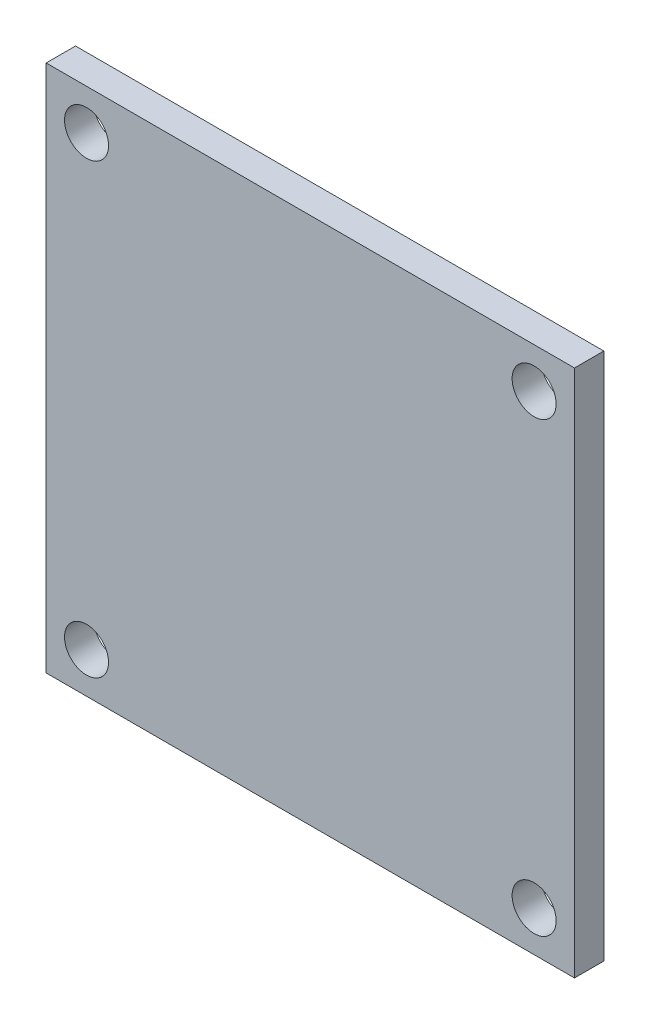
ISO-10303-21;
HEADER;
FILE_DESCRIPTION(('STEP AP214'),'2;1');
FILE_NAME('part.step','',(''),(''),'','','');
FILE_SCHEMA(('AUTOMOTIVE_DESIGN { 1 0 10303 214 1 1 1 1 }'));
ENDSEC;
DATA;
#1=APPLICATION_CONTEXT('core data for automotive mechanical design processes');
#2=APPLICATION_PROTOCOL_DEFINITION('international standard','automotive_design',2000,#1);
#3=PRODUCT_CONTEXT('',#1,'mechanical');
#4=PRODUCT('Part','Part','',(#3));
#5=PRODUCT_RELATED_PRODUCT_CATEGORY('part','',(#4));
#6=PRODUCT_DEFINITION_FORMATION('','',#4);
#7=PRODUCT_DEFINITION_CONTEXT('part definition',#1,'design');
#8=PRODUCT_DEFINITION('design','',#6,#7);
#9=PRODUCT_DEFINITION_SHAPE('','',#8);
#10=(LENGTH_UNIT() NAMED_UNIT(*) SI_UNIT(.MILLI.,.METRE.));
#11=(NAMED_UNIT(*) PLANE_ANGLE_UNIT() SI_UNIT($,.RADIAN.));
#12=(NAMED_UNIT(*) SI_UNIT($,.STERADIAN.) SOLID_ANGLE_UNIT());
#13=UNCERTAINTY_MEASURE_WITH_UNIT(LENGTH_MEASURE(1.E-05),#10,'distance_accuracy_value','');
#14=(GEOMETRIC_REPRESENTATION_CONTEXT(3) GLOBAL_UNCERTAINTY_ASSIGNED_CONTEXT((#13)) GLOBAL_UNIT_ASSIGNED_CONTEXT((#10,
#11,#12)) REPRESENTATION_CONTEXT('',''));
#15=CARTESIAN_POINT('',(0.,0.,0.));
#16=DIRECTION('',(0.,0.,1.));
#17=DIRECTION('',(1.,0.,0.));
#18=AXIS2_PLACEMENT_3D('',#15,#16,#17);
#19=CARTESIAN_POINT('',(0.,0.,2.));
#20=DIRECTION('',(0.,0.,1.));
#21=DIRECTION('',(1.,0.,0.));
#22=AXIS2_PLACEMENT_3D('',#19,#20,#21);
#23=PLANE('',#22);
#24=CARTESIAN_POINT('',(-15.25,-15.25,2.));
#25=DIRECTION('',(0.,0.,1.));
#26=DIRECTION('',(1.,0.,0.));
#27=AXIS2_PLACEMENT_3D('',#24,#25,#26);
#28=CIRCLE('',#27,1.5);
#29=CARTESIAN_POINT('',(-13.75,-15.25,2.));
#30=VERTEX_POINT('',#29);
#31=EDGE_CURVE('E121',#30,#30,#28,.T.);
#32=ORIENTED_EDGE('',*,*,#31,.F.);
#33=EDGE_LOOP('',(#32));
#34=FACE_BOUND('',#33,.T.);
#35=CARTESIAN_POINT('',(15.25,15.25,2.));
#36=DIRECTION('',(0.,0.,1.));
#37=DIRECTION('',(1.,0.,0.));
#38=AXIS2_PLACEMENT_3D('',#35,#36,#37);
#39=CIRCLE('',#38,1.5);
#40=CARTESIAN_POINT('',(16.75,15.25,2.));
#41=VERTEX_POINT('',#40);
#42=EDGE_CURVE('E100',#41,#41,#39,.T.);
#43=ORIENTED_EDGE('',*,*,#42,.F.);
#44=EDGE_LOOP('',(#43));
#45=FACE_BOUND('',#44,.T.);
#46=DIRECTION('',(0.,-1.,0.));
#47=VECTOR('',#46,1.);
#48=CARTESIAN_POINT('',(-18.,18.,2.));
#49=LINE('',#48,#47);
#50=CARTESIAN_POINT('',(-18.,18.,2.));
#51=VERTEX_POINT('',#50);
#52=CARTESIAN_POINT('',(-18.,-18.,2.));
#53=VERTEX_POINT('',#52);
#54=EDGE_CURVE('E85',#51,#53,#49,.T.);
#55=ORIENTED_EDGE('',*,*,#54,.T.);
#56=DIRECTION('',(1.,0.,0.));
#57=VECTOR('',#56,1.);
#58=CARTESIAN_POINT('',(-18.,-18.,2.));
#59=LINE('',#58,#57);
#60=CARTESIAN_POINT('',(18.,-18.,2.));
#61=VERTEX_POINT('',#60);
#62=EDGE_CURVE('E80',#53,#61,#59,.T.);
#63=ORIENTED_EDGE('',*,*,#62,.T.);
#64=DIRECTION('',(0.,1.,0.));
#65=VECTOR('',#64,1.);
#66=CARTESIAN_POINT('',(18.,18.,2.));
#67=LINE('',#66,#65);
#68=CARTESIAN_POINT('',(18.,18.,2.));
#69=VERTEX_POINT('',#68);
#70=EDGE_CURVE('E83',#61,#69,#67,.T.);
#71=ORIENTED_EDGE('',*,*,#70,.T.);
#72=DIRECTION('',(-1.,0.,0.));
#73=VECTOR('',#72,1.);
#74=CARTESIAN_POINT('',(-18.,18.,2.));
#75=LINE('',#74,#73);
#76=EDGE_CURVE('E50',#69,#51,#75,.T.);
#77=ORIENTED_EDGE('',*,*,#76,.T.);
#78=EDGE_LOOP('',(#55,#63,#71,#77));
#79=FACE_BOUND('',#78,.T.);
#80=CARTESIAN_POINT('',(-15.25,15.25,2.));
#81=DIRECTION('',(0.,0.,1.));
#82=DIRECTION('',(1.,0.,0.));
#83=AXIS2_PLACEMENT_3D('',#80,#81,#82);
#84=CIRCLE('',#83,1.5);
#85=CARTESIAN_POINT('',(-13.75,15.25,2.));
#86=VERTEX_POINT('',#85);
#87=EDGE_CURVE('E115',#86,#86,#84,.T.);
#88=ORIENTED_EDGE('',*,*,#87,.F.);
#89=EDGE_LOOP('',(#88));
#90=FACE_BOUND('',#89,.T.);
#91=CARTESIAN_POINT('',(15.25,-15.25,2.));
#92=DIRECTION('',(0.,0.,1.));
#93=DIRECTION('',(1.,0.,0.));
#94=AXIS2_PLACEMENT_3D('',#91,#92,#93);
#95=CIRCLE('',#94,1.5);
#96=CARTESIAN_POINT('',(16.75,-15.25,2.));
#97=VERTEX_POINT('',#96);
#98=EDGE_CURVE('E127',#97,#97,#95,.T.);
#99=ORIENTED_EDGE('',*,*,#98,.F.);
#100=EDGE_LOOP('',(#99));
#101=FACE_BOUND('',#100,.T.);
#102=ADVANCED_FACE('F33',(#34,#45,#79,#90,#101),#23,.T.);
#103=CARTESIAN_POINT('',(0.,0.,0.));
#104=DIRECTION('',(0.,0.,1.));
#105=DIRECTION('',(1.,0.,0.));
#106=AXIS2_PLACEMENT_3D('',#103,#104,#105);
#107=PLANE('',#106);
#108=CARTESIAN_POINT('',(-15.25,-15.25,0.));
#109=DIRECTION('',(0.,0.,1.));
#110=DIRECTION('',(1.,0.,0.));
#111=AXIS2_PLACEMENT_3D('',#108,#109,#110);
#112=CIRCLE('',#111,1.5);
#113=CARTESIAN_POINT('',(-13.75,-15.25,0.));
#114=VERTEX_POINT('',#113);
#115=EDGE_CURVE('E124',#114,#114,#112,.T.);
#116=ORIENTED_EDGE('',*,*,#115,.T.);
#117=EDGE_LOOP('',(#116));
#118=FACE_BOUND('',#117,.T.);
#119=CARTESIAN_POINT('',(15.25,15.25,0.));
#120=DIRECTION('',(0.,0.,1.));
#121=DIRECTION('',(1.,0.,0.));
#122=AXIS2_PLACEMENT_3D('',#119,#120,#121);
#123=CIRCLE('',#122,1.5);
#124=CARTESIAN_POINT('',(16.75,15.25,0.));
#125=VERTEX_POINT('',#124);
#126=EDGE_CURVE('E112',#125,#125,#123,.T.);
#127=ORIENTED_EDGE('',*,*,#126,.T.);
#128=EDGE_LOOP('',(#127));
#129=FACE_BOUND('',#128,.T.);
#130=DIRECTION('',(0.,-1.,0.));
#131=VECTOR('',#130,1.);
#132=CARTESIAN_POINT('',(-18.,18.,0.));
#133=LINE('',#132,#131);
#134=CARTESIAN_POINT('',(-18.,18.,0.));
#135=VERTEX_POINT('',#134);
#136=CARTESIAN_POINT('',(-18.,-18.,0.));
#137=VERTEX_POINT('',#136);
#138=EDGE_CURVE('E97',#135,#137,#133,.T.);
#139=ORIENTED_EDGE('',*,*,#138,.F.);
#140=DIRECTION('',(-1.,0.,0.));
#141=VECTOR('',#140,1.);
#142=CARTESIAN_POINT('',(-18.,18.,0.));
#143=LINE('',#142,#141);
#144=CARTESIAN_POINT('',(18.,18.,0.));
#145=VERTEX_POINT('',#144);
#146=EDGE_CURVE('E73',#145,#135,#143,.T.);
#147=ORIENTED_EDGE('',*,*,#146,.F.);
#148=DIRECTION('',(0.,1.,0.));
#149=VECTOR('',#148,1.);
#150=CARTESIAN_POINT('',(18.,18.,0.));
#151=LINE('',#150,#149);
#152=CARTESIAN_POINT('',(18.,-18.,0.));
#153=VERTEX_POINT('',#152);
#154=EDGE_CURVE('E67',#153,#145,#151,.T.);
#155=ORIENTED_EDGE('',*,*,#154,.F.);
#156=DIRECTION('',(1.,0.,0.));
#157=VECTOR('',#156,1.);
#158=CARTESIAN_POINT('',(-18.,-18.,0.));
#159=LINE('',#158,#157);
#160=EDGE_CURVE('E89',#137,#153,#159,.T.);
#161=ORIENTED_EDGE('',*,*,#160,.F.);
#162=EDGE_LOOP('',(#139,#147,#155,#161));
#163=FACE_BOUND('',#162,.T.);
#164=CARTESIAN_POINT('',(-15.25,15.25,0.));
#165=DIRECTION('',(0.,0.,1.));
#166=DIRECTION('',(1.,0.,0.));
#167=AXIS2_PLACEMENT_3D('',#164,#165,#166);
#168=CIRCLE('',#167,1.5);
#169=CARTESIAN_POINT('',(-13.75,15.25,0.));
#170=VERTEX_POINT('',#169);
#171=EDGE_CURVE('E118',#170,#170,#168,.T.);
#172=ORIENTED_EDGE('',*,*,#171,.T.);
#173=EDGE_LOOP('',(#172));
#174=FACE_BOUND('',#173,.T.);
#175=CARTESIAN_POINT('',(15.25,-15.25,0.));
#176=DIRECTION('',(0.,0.,1.));
#177=DIRECTION('',(1.,0.,0.));
#178=AXIS2_PLACEMENT_3D('',#175,#176,#177);
#179=CIRCLE('',#178,1.5);
#180=CARTESIAN_POINT('',(16.75,-15.25,0.));
#181=VERTEX_POINT('',#180);
#182=EDGE_CURVE('E130',#181,#181,#179,.T.);
#183=ORIENTED_EDGE('',*,*,#182,.T.);
#184=EDGE_LOOP('',(#183));
#185=FACE_BOUND('',#184,.T.);
#186=ADVANCED_FACE('F108',(#118,#129,#163,#174,#185),#107,.F.);
#187=CARTESIAN_POINT('',(-18.,18.,2.));
#188=DIRECTION('',(1.,0.,0.));
#189=DIRECTION('',(0.,1.,0.));
#190=AXIS2_PLACEMENT_3D('',#187,#188,#189);
#191=PLANE('',#190);
#192=ORIENTED_EDGE('',*,*,#138,.T.);
#193=DIRECTION('',(0.,0.,-1.));
#194=VECTOR('',#193,1.);
#195=CARTESIAN_POINT('',(-18.,-18.,2.));
#196=LINE('',#195,#194);
#197=EDGE_CURVE('E11',#53,#137,#196,.T.);
#198=ORIENTED_EDGE('',*,*,#197,.F.);
#199=ORIENTED_EDGE('',*,*,#54,.F.);
#200=DIRECTION('',(0.,0.,-1.));
#201=VECTOR('',#200,1.);
#202=CARTESIAN_POINT('',(-18.,18.,2.));
#203=LINE('',#202,#201);
#204=EDGE_CURVE('E93',#51,#135,#203,.T.);
#205=ORIENTED_EDGE('',*,*,#204,.T.);
#206=EDGE_LOOP('',(#192,#198,#199,#205));
#207=FACE_BOUND('',#206,.T.);
#208=ADVANCED_FACE('F35',(#207),#191,.F.);
#209=CARTESIAN_POINT('',(-18.,-18.,2.));
#210=DIRECTION('',(0.,1.,0.));
#211=DIRECTION('',(0.,0.,1.));
#212=AXIS2_PLACEMENT_3D('',#209,#210,#211);
#213=PLANE('',#212);
#214=ORIENTED_EDGE('',*,*,#160,.T.);
#215=DIRECTION('',(0.,0.,-1.));
#216=VECTOR('',#215,1.);
#217=CARTESIAN_POINT('',(18.,-18.,2.));
#218=LINE('',#217,#216);
#219=EDGE_CURVE('E42',#61,#153,#218,.T.);
#220=ORIENTED_EDGE('',*,*,#219,.F.);
#221=ORIENTED_EDGE('',*,*,#62,.F.);
#222=ORIENTED_EDGE('',*,*,#197,.T.);
#223=EDGE_LOOP('',(#214,#220,#221,#222));
#224=FACE_BOUND('',#223,.T.);
#225=ADVANCED_FACE('F88',(#224),#213,.F.);
#226=CARTESIAN_POINT('',(18.,18.,2.));
#227=DIRECTION('',(-1.,0.,0.));
#228=DIRECTION('',(0.,-1.,0.));
#229=AXIS2_PLACEMENT_3D('',#226,#227,#228);
#230=PLANE('',#229);
#231=ORIENTED_EDGE('',*,*,#154,.T.);
#232=DIRECTION('',(0.,0.,-1.));
#233=VECTOR('',#232,1.);
#234=CARTESIAN_POINT('',(18.,18.,2.));
#235=LINE('',#234,#233);
#236=EDGE_CURVE('E90',#69,#145,#235,.T.);
#237=ORIENTED_EDGE('',*,*,#236,.F.);
#238=ORIENTED_EDGE('',*,*,#70,.F.);
#239=ORIENTED_EDGE('',*,*,#219,.T.);
#240=EDGE_LOOP('',(#231,#237,#238,#239));
#241=FACE_BOUND('',#240,.T.);
#242=ADVANCED_FACE('F91',(#241),#230,.F.);
#243=CARTESIAN_POINT('',(-18.,18.,2.));
#244=DIRECTION('',(0.,-1.,0.));
#245=DIRECTION('',(0.,0.,-1.));
#246=AXIS2_PLACEMENT_3D('',#243,#244,#245);
#247=PLANE('',#246);
#248=ORIENTED_EDGE('',*,*,#146,.T.);
#249=ORIENTED_EDGE('',*,*,#204,.F.);
#250=ORIENTED_EDGE('',*,*,#76,.F.);
#251=ORIENTED_EDGE('',*,*,#236,.T.);
#252=EDGE_LOOP('',(#248,#249,#250,#251));
#253=FACE_BOUND('',#252,.T.);
#254=ADVANCED_FACE('F105',(#253),#247,.F.);
#255=CARTESIAN_POINT('',(15.25,15.25,2.));
#256=DIRECTION('',(0.,0.,-1.));
#257=DIRECTION('',(-1.,0.,0.));
#258=AXIS2_PLACEMENT_3D('',#255,#256,#257);
#259=CYLINDRICAL_SURFACE('',#258,1.5);
#260=ORIENTED_EDGE('',*,*,#42,.T.);
#261=EDGE_LOOP('',(#260));
#262=FACE_BOUND('',#261,.T.);
#263=ORIENTED_EDGE('',*,*,#126,.F.);
#264=EDGE_LOOP('',(#263));
#265=FACE_BOUND('',#264,.T.);
#266=ADVANCED_FACE('F150',(#262,#265),#259,.F.);
#267=CARTESIAN_POINT('',(-15.25,15.25,2.));
#268=DIRECTION('',(0.,0.,-1.));
#269=DIRECTION('',(-1.,0.,0.));
#270=AXIS2_PLACEMENT_3D('',#267,#268,#269);
#271=CYLINDRICAL_SURFACE('',#270,1.5);
#272=ORIENTED_EDGE('',*,*,#87,.T.);
#273=EDGE_LOOP('',(#272));
#274=FACE_BOUND('',#273,.T.);
#275=ORIENTED_EDGE('',*,*,#171,.F.);
#276=EDGE_LOOP('',(#275));
#277=FACE_BOUND('',#276,.T.);
#278=ADVANCED_FACE('F196',(#274,#277),#271,.F.);
#279=CARTESIAN_POINT('',(-15.25,-15.25,2.));
#280=DIRECTION('',(0.,0.,-1.));
#281=DIRECTION('',(-1.,0.,0.));
#282=AXIS2_PLACEMENT_3D('',#279,#280,#281);
#283=CYLINDRICAL_SURFACE('',#282,1.5);
#284=ORIENTED_EDGE('',*,*,#31,.T.);
#285=EDGE_LOOP('',(#284));
#286=FACE_BOUND('',#285,.T.);
#287=ORIENTED_EDGE('',*,*,#115,.F.);
#288=EDGE_LOOP('',(#287));
#289=FACE_BOUND('',#288,.T.);
#290=ADVANCED_FACE('F204',(#286,#289),#283,.F.);
#291=CARTESIAN_POINT('',(15.25,-15.25,2.));
#292=DIRECTION('',(0.,0.,-1.));
#293=DIRECTION('',(-1.,0.,0.));
#294=AXIS2_PLACEMENT_3D('',#291,#292,#293);
#295=CYLINDRICAL_SURFACE('',#294,1.5);
#296=ORIENTED_EDGE('',*,*,#98,.T.);
#297=EDGE_LOOP('',(#296));
#298=FACE_BOUND('',#297,.T.);
#299=ORIENTED_EDGE('',*,*,#182,.F.);
#300=EDGE_LOOP('',(#299));
#301=FACE_BOUND('',#300,.T.);
#302=ADVANCED_FACE('F136',(#298,#301),#295,.F.);
#303=CLOSED_SHELL('',(#102,#186,#208,#225,#242,#254,#266,#278,#290,#302));
#304=MANIFOLD_SOLID_BREP('B2',#303);
#305=ADVANCED_BREP_SHAPE_REPRESENTATION('',(#18,#304),#14);
#306=SHAPE_DEFINITION_REPRESENTATION(#9,#305);
ENDSEC;
END-ISO-10303-21;
